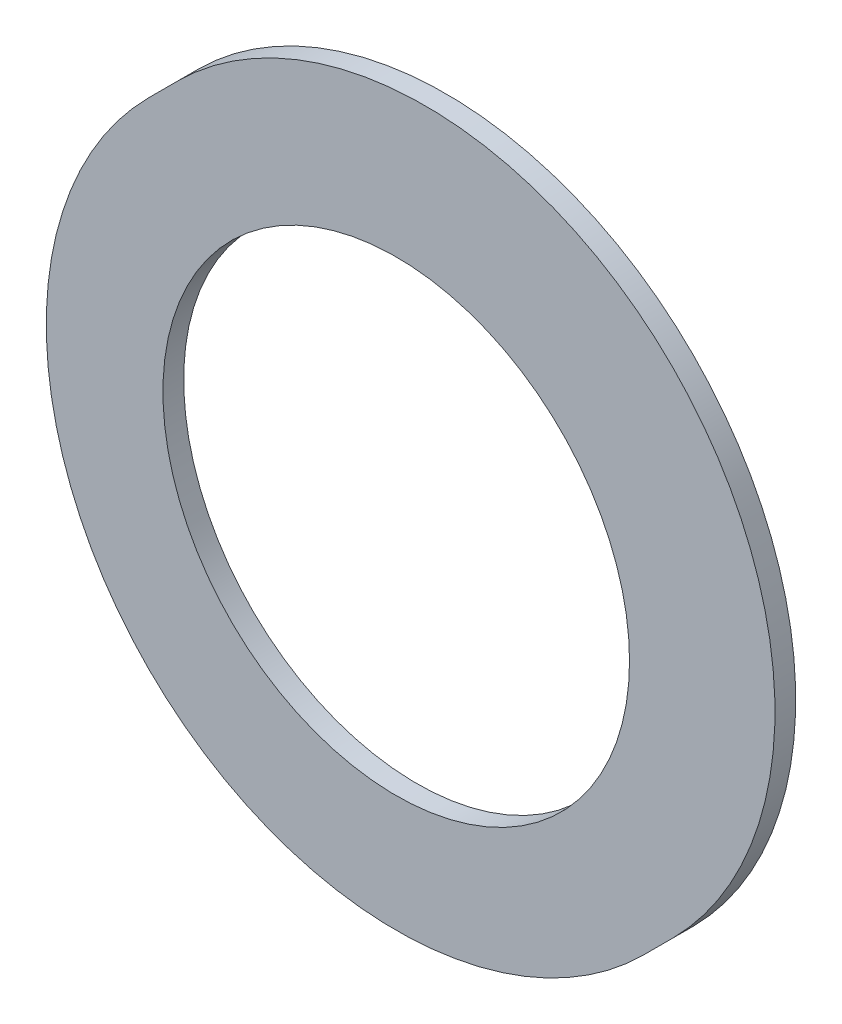
ISO-10303-21;
HEADER;
FILE_DESCRIPTION(('STEP AP214'),'2;1');
FILE_NAME('part.step','',(''),(''),'','','');
FILE_SCHEMA(('AUTOMOTIVE_DESIGN { 1 0 10303 214 1 1 1 1 }'));
ENDSEC;
DATA;
#1=APPLICATION_CONTEXT('core data for automotive mechanical design processes');
#2=APPLICATION_PROTOCOL_DEFINITION('international standard','automotive_design',2000,#1);
#3=PRODUCT_CONTEXT('',#1,'mechanical');
#4=PRODUCT('Part','Part','',(#3));
#5=PRODUCT_RELATED_PRODUCT_CATEGORY('part','',(#4));
#6=PRODUCT_DEFINITION_FORMATION('','',#4);
#7=PRODUCT_DEFINITION_CONTEXT('part definition',#1,'design');
#8=PRODUCT_DEFINITION('design','',#6,#7);
#9=PRODUCT_DEFINITION_SHAPE('','',#8);
#10=(LENGTH_UNIT() NAMED_UNIT(*) SI_UNIT(.MILLI.,.METRE.));
#11=(NAMED_UNIT(*) PLANE_ANGLE_UNIT() SI_UNIT($,.RADIAN.));
#12=(NAMED_UNIT(*) SI_UNIT($,.STERADIAN.) SOLID_ANGLE_UNIT());
#13=UNCERTAINTY_MEASURE_WITH_UNIT(LENGTH_MEASURE(1.E-05),#10,'distance_accuracy_value','');
#14=(GEOMETRIC_REPRESENTATION_CONTEXT(3) GLOBAL_UNCERTAINTY_ASSIGNED_CONTEXT((#13)) GLOBAL_UNIT_ASSIGNED_CONTEXT((#10,
#11,#12)) REPRESENTATION_CONTEXT('',''));
#15=CARTESIAN_POINT('',(0.,0.,0.));
#16=DIRECTION('',(0.,0.,1.));
#17=DIRECTION('',(1.,0.,0.));
#18=AXIS2_PLACEMENT_3D('',#15,#16,#17);
#19=CARTESIAN_POINT('',(67.20426742,87.61574298,0.));
#20=DIRECTION('',(-0.707106781186649,0.707106781186446,0.));
#21=DIRECTION('',(0.707106781186446,0.707106781186649,0.));
#22=AXIS2_PLACEMENT_3D('',#19,#20,#21);
#23=PLANE('',#22);
#24=DIRECTION('',(0.707106781186446,0.707106781186649,0.));
#25=VECTOR('',#24,1.);
#26=CARTESIAN_POINT('',(67.20426742,87.61574298,0.03556));
#27=LINE('',#26,#25);
#28=CARTESIAN_POINT('',(67.20426742,87.61574298,0.03556));
#29=VERTEX_POINT('',#28);
#30=CARTESIAN_POINT('',(67.25364502,87.66512058,0.03556));
#31=VERTEX_POINT('',#30);
#32=EDGE_CURVE('E11',#29,#31,#27,.T.);
#33=ORIENTED_EDGE('',*,*,#32,.F.);
#34=DIRECTION('',(0.,0.,1.));
#35=VECTOR('',#34,1.);
#36=CARTESIAN_POINT('',(67.20426742,87.61574298,0.));
#37=LINE('',#36,#35);
#38=CARTESIAN_POINT('',(67.20426742,87.61574298,0.));
#39=VERTEX_POINT('',#38);
#40=EDGE_CURVE('E24',#39,#29,#37,.T.);
#41=ORIENTED_EDGE('',*,*,#40,.F.);
#42=DIRECTION('',(0.707106781186446,0.707106781186649,0.));
#43=VECTOR('',#42,1.);
#44=CARTESIAN_POINT('',(67.20426742,87.61574298,0.));
#45=LINE('',#44,#43);
#46=CARTESIAN_POINT('',(67.25364502,87.66512058,0.));
#47=VERTEX_POINT('',#46);
#48=EDGE_CURVE('E96',#39,#47,#45,.T.);
#49=ORIENTED_EDGE('',*,*,#48,.T.);
#50=DIRECTION('',(0.,0.,1.));
#51=VECTOR('',#50,1.);
#52=CARTESIAN_POINT('',(67.25364502,87.66512058,0.));
#53=LINE('',#52,#51);
#54=EDGE_CURVE('E37',#47,#31,#53,.T.);
#55=ORIENTED_EDGE('',*,*,#54,.T.);
#56=EDGE_LOOP('',(#33,#41,#49,#55));
#57=FACE_BOUND('',#56,.T.);
#58=ADVANCED_FACE('F17',(#57),#23,.F.);
#59=CARTESIAN_POINT('',(66.7800036,88.0400068,0.));
#60=DIRECTION('',(0.,0.,-1.));
#61=DIRECTION('',(-0.707106781186548,0.707106781186548,0.));
#62=AXIS2_PLACEMENT_3D('',#59,#60,#61);
#63=CYLINDRICAL_SURFACE('',#62,0.599999648268228);
#64=CARTESIAN_POINT('',(66.7800036,88.0400068,0.03556));
#65=DIRECTION('',(0.,0.,1.));
#66=DIRECTION('',(-0.707106781186548,0.707106781186548,0.));
#67=AXIS2_PLACEMENT_3D('',#64,#65,#66);
#68=CIRCLE('',#67,0.599999648268228);
#69=CARTESIAN_POINT('',(66.35573978,88.46427062,0.03556));
#70=VERTEX_POINT('',#69);
#71=EDGE_CURVE('E92',#70,#29,#68,.T.);
#72=ORIENTED_EDGE('',*,*,#71,.F.);
#73=DIRECTION('',(0.,0.,1.));
#74=VECTOR('',#73,1.);
#75=CARTESIAN_POINT('',(66.35573978,88.46427062,0.));
#76=LINE('',#75,#74);
#77=CARTESIAN_POINT('',(66.35573978,88.46427062,0.));
#78=VERTEX_POINT('',#77);
#79=EDGE_CURVE('E90',#78,#70,#76,.T.);
#80=ORIENTED_EDGE('',*,*,#79,.F.);
#81=CARTESIAN_POINT('',(66.7800036,88.0400068,0.));
#82=DIRECTION('',(0.,0.,1.));
#83=DIRECTION('',(-0.707106781186548,0.707106781186548,0.));
#84=AXIS2_PLACEMENT_3D('',#81,#82,#83);
#85=CIRCLE('',#84,0.599999648268228);
#86=EDGE_CURVE('E88',#78,#39,#85,.T.);
#87=ORIENTED_EDGE('',*,*,#86,.T.);
#88=ORIENTED_EDGE('',*,*,#40,.T.);
#89=EDGE_LOOP('',(#72,#80,#87,#88));
#90=FACE_BOUND('',#89,.T.);
#91=ADVANCED_FACE('F111',(#90),#63,.T.);
#92=CARTESIAN_POINT('',(66.8293812,88.0893844,0.));
#93=DIRECTION('',(0.,0.,-1.));
#94=DIRECTION('',(0.707106781186536,-0.707106781186559,0.));
#95=AXIS2_PLACEMENT_3D('',#92,#93,#94);
#96=CYLINDRICAL_SURFACE('',#95,0.599999648268215);
#97=CARTESIAN_POINT('',(66.8293812,88.0893844,0.03556));
#98=DIRECTION('',(0.,0.,1.));
#99=DIRECTION('',(0.707106781186536,-0.707106781186559,0.));
#100=AXIS2_PLACEMENT_3D('',#97,#98,#99);
#101=CIRCLE('',#100,0.599999648268215);
#102=CARTESIAN_POINT('',(66.40511738,88.51364822,0.03556));
#103=VERTEX_POINT('',#102);
#104=EDGE_CURVE('E85',#31,#103,#101,.T.);
#105=ORIENTED_EDGE('',*,*,#104,.F.);
#106=ORIENTED_EDGE('',*,*,#54,.F.);
#107=CARTESIAN_POINT('',(66.8293812,88.0893844,0.));
#108=DIRECTION('',(0.,0.,1.));
#109=DIRECTION('',(0.707106781186536,-0.707106781186559,0.));
#110=AXIS2_PLACEMENT_3D('',#107,#108,#109);
#111=CIRCLE('',#110,0.599999648268215);
#112=CARTESIAN_POINT('',(66.40511738,88.51364822,0.));
#113=VERTEX_POINT('',#112);
#114=EDGE_CURVE('E82',#47,#113,#111,.T.);
#115=ORIENTED_EDGE('',*,*,#114,.T.);
#116=DIRECTION('',(0.,0.,1.));
#117=VECTOR('',#116,1.);
#118=CARTESIAN_POINT('',(66.40511738,88.51364822,0.));
#119=LINE('',#118,#117);
#120=EDGE_CURVE('E80',#113,#103,#119,.T.);
#121=ORIENTED_EDGE('',*,*,#120,.T.);
#122=EDGE_LOOP('',(#105,#106,#115,#121));
#123=FACE_BOUND('',#122,.T.);
#124=ADVANCED_FACE('F104',(#123),#96,.T.);
#125=CARTESIAN_POINT('',(66.40511738,88.51364822,0.));
#126=DIRECTION('',(0.707106781186446,-0.707106781186649,0.));
#127=DIRECTION('',(-0.707106781186649,-0.707106781186446,0.));
#128=AXIS2_PLACEMENT_3D('',#125,#126,#127);
#129=PLANE('',#128);
#130=DIRECTION('',(-0.707106781186649,-0.707106781186446,0.));
#131=VECTOR('',#130,1.);
#132=CARTESIAN_POINT('',(66.40511738,88.51364822,0.03556));
#133=LINE('',#132,#131);
#134=EDGE_CURVE('E77',#103,#70,#133,.T.);
#135=ORIENTED_EDGE('',*,*,#134,.F.);
#136=ORIENTED_EDGE('',*,*,#120,.F.);
#137=DIRECTION('',(-0.707106781186649,-0.707106781186446,0.));
#138=VECTOR('',#137,1.);
#139=CARTESIAN_POINT('',(66.40511738,88.51364822,0.));
#140=LINE('',#139,#138);
#141=EDGE_CURVE('E68',#113,#78,#140,.T.);
#142=ORIENTED_EDGE('',*,*,#141,.T.);
#143=ORIENTED_EDGE('',*,*,#79,.T.);
#144=EDGE_LOOP('',(#135,#136,#142,#143));
#145=FACE_BOUND('',#144,.T.);
#146=ADVANCED_FACE('F110',(#145),#129,.F.);
#147=CARTESIAN_POINT('',(66.7800036,88.0400068,0.));
#148=DIRECTION('',(0.,0.,-1.));
#149=DIRECTION('',(1.,0.,0.));
#150=AXIS2_PLACEMENT_3D('',#147,#148,#149);
#151=CYLINDRICAL_SURFACE('',#150,0.3999992);
#152=DIRECTION('',(0.,0.,1.));
#153=VECTOR('',#152,1.);
#154=CARTESIAN_POINT('',(67.1800028,88.0400068,0.));
#155=LINE('',#154,#153);
#156=CARTESIAN_POINT('',(67.1800028,88.0400068,0.));
#157=VERTEX_POINT('',#156);
#158=CARTESIAN_POINT('',(67.1800028,88.0400068,0.03556));
#159=VERTEX_POINT('',#158);
#160=EDGE_CURVE('E62',#157,#159,#155,.T.);
#161=ORIENTED_EDGE('',*,*,#160,.T.);
#162=CARTESIAN_POINT('',(66.7800036,88.0400068,0.03556));
#163=DIRECTION('',(0.,0.,1.));
#164=DIRECTION('',(1.,0.,0.));
#165=AXIS2_PLACEMENT_3D('',#162,#163,#164);
#166=CIRCLE('',#165,0.3999992);
#167=EDGE_CURVE('E67',#159,#159,#166,.T.);
#168=ORIENTED_EDGE('',*,*,#167,.T.);
#169=ORIENTED_EDGE('',*,*,#160,.F.);
#170=CARTESIAN_POINT('',(66.7800036,88.0400068,0.));
#171=DIRECTION('',(0.,0.,1.));
#172=DIRECTION('',(1.,0.,0.));
#173=AXIS2_PLACEMENT_3D('',#170,#171,#172);
#174=CIRCLE('',#173,0.3999992);
#175=EDGE_CURVE('E65',#157,#157,#174,.T.);
#176=ORIENTED_EDGE('',*,*,#175,.F.);
#177=EDGE_LOOP('',(#161,#168,#169,#176));
#178=FACE_BOUND('',#177,.T.);
#179=ADVANCED_FACE('F64',(#178),#151,.F.);
#180=CARTESIAN_POINT('',(67.20426742,87.61574298,0.));
#181=DIRECTION('',(0.,0.,-1.));
#182=DIRECTION('',(-1.,0.,0.));
#183=AXIS2_PLACEMENT_3D('',#180,#181,#182);
#184=PLANE('',#183);
#185=ORIENTED_EDGE('',*,*,#48,.F.);
#186=ORIENTED_EDGE('',*,*,#86,.F.);
#187=ORIENTED_EDGE('',*,*,#141,.F.);
#188=ORIENTED_EDGE('',*,*,#114,.F.);
#189=EDGE_LOOP('',(#185,#186,#187,#188));
#190=FACE_BOUND('',#189,.T.);
#191=ORIENTED_EDGE('',*,*,#175,.T.);
#192=EDGE_LOOP('',(#191));
#193=FACE_BOUND('',#192,.T.);
#194=ADVANCED_FACE('F71',(#190,#193),#184,.T.);
#195=CARTESIAN_POINT('',(67.20426742,87.61574298,0.03556));
#196=DIRECTION('',(0.,0.,-1.));
#197=DIRECTION('',(-1.,0.,0.));
#198=AXIS2_PLACEMENT_3D('',#195,#196,#197);
#199=PLANE('',#198);
#200=ORIENTED_EDGE('',*,*,#134,.T.);
#201=ORIENTED_EDGE('',*,*,#71,.T.);
#202=ORIENTED_EDGE('',*,*,#32,.T.);
#203=ORIENTED_EDGE('',*,*,#104,.T.);
#204=EDGE_LOOP('',(#200,#201,#202,#203));
#205=FACE_BOUND('',#204,.T.);
#206=ORIENTED_EDGE('',*,*,#167,.F.);
#207=EDGE_LOOP('',(#206));
#208=FACE_BOUND('',#207,.T.);
#209=ADVANCED_FACE('F107',(#205,#208),#199,.F.);
#210=CLOSED_SHELL('',(#58,#91,#124,#146,#179,#194,#209));
#211=MANIFOLD_SOLID_BREP('B1',#210);
#212=ADVANCED_BREP_SHAPE_REPRESENTATION('',(#18,#211),#14);
#213=SHAPE_DEFINITION_REPRESENTATION(#9,#212);
ENDSEC;
END-ISO-10303-21;
